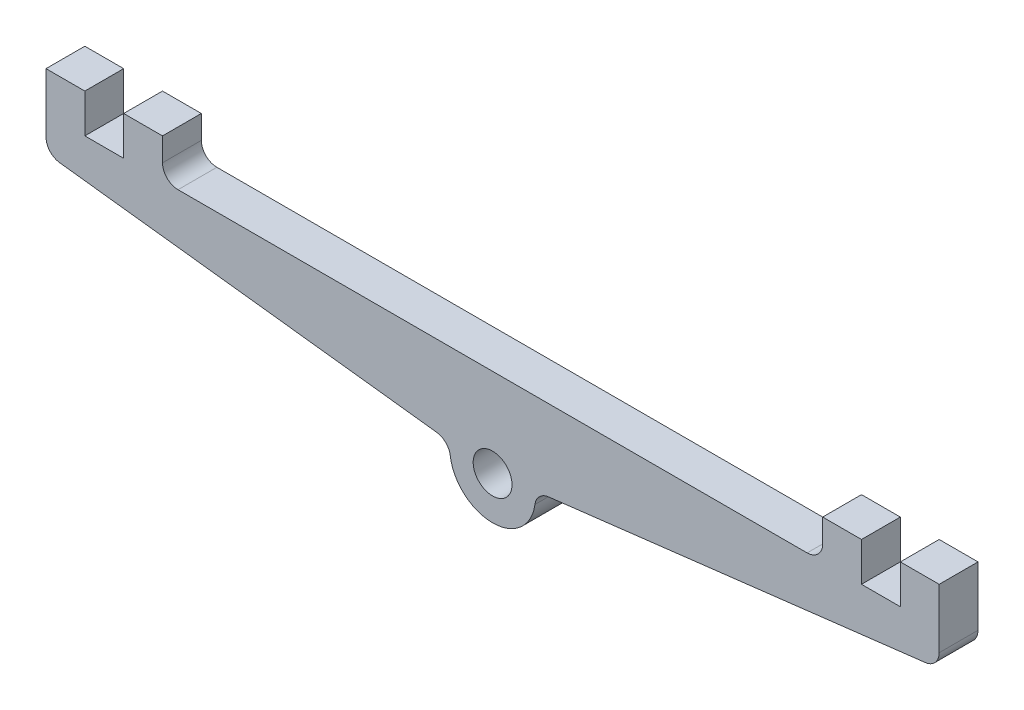
ISO-10303-21;
HEADER;
FILE_DESCRIPTION(('STEP AP214'),'2;1');
FILE_NAME('part.step','',(''),(''),'','','');
FILE_SCHEMA(('AUTOMOTIVE_DESIGN { 1 0 10303 214 1 1 1 1 }'));
ENDSEC;
DATA;
#1=APPLICATION_CONTEXT('core data for automotive mechanical design processes');
#2=APPLICATION_PROTOCOL_DEFINITION('international standard','automotive_design',2000,#1);
#3=PRODUCT_CONTEXT('',#1,'mechanical');
#4=PRODUCT('Part','Part','',(#3));
#5=PRODUCT_RELATED_PRODUCT_CATEGORY('part','',(#4));
#6=PRODUCT_DEFINITION_FORMATION('','',#4);
#7=PRODUCT_DEFINITION_CONTEXT('part definition',#1,'design');
#8=PRODUCT_DEFINITION('design','',#6,#7);
#9=PRODUCT_DEFINITION_SHAPE('','',#8);
#10=(LENGTH_UNIT() NAMED_UNIT(*) SI_UNIT(.MILLI.,.METRE.));
#11=(NAMED_UNIT(*) PLANE_ANGLE_UNIT() SI_UNIT($,.RADIAN.));
#12=(NAMED_UNIT(*) SI_UNIT($,.STERADIAN.) SOLID_ANGLE_UNIT());
#13=UNCERTAINTY_MEASURE_WITH_UNIT(LENGTH_MEASURE(1.E-05),#10,'distance_accuracy_value','');
#14=(GEOMETRIC_REPRESENTATION_CONTEXT(3) GLOBAL_UNCERTAINTY_ASSIGNED_CONTEXT((#13)) GLOBAL_UNIT_ASSIGNED_CONTEXT((#10,
#11,#12)) REPRESENTATION_CONTEXT('',''));
#15=CARTESIAN_POINT('',(0.,0.,0.));
#16=DIRECTION('',(0.,0.,1.));
#17=DIRECTION('',(1.,0.,0.));
#18=AXIS2_PLACEMENT_3D('',#15,#16,#17);
#19=CARTESIAN_POINT('',(-70.485,11.1402036282603,6.35));
#20=DIRECTION('',(0.,0.,1.));
#21=DIRECTION('',(1.,0.,0.));
#22=AXIS2_PLACEMENT_3D('',#19,#20,#21);
#23=PLANE('',#22);
#24=DIRECTION('',(0.,1.,0.));
#25=VECTOR('',#24,1.);
#26=CARTESIAN_POINT('',(-66.675,14.478,6.35));
#27=LINE('',#26,#25);
#28=CARTESIAN_POINT('',(-66.675,14.478,6.35));
#29=VERTEX_POINT('',#28);
#30=CARTESIAN_POINT('',(-66.675,20.828,6.35));
#31=VERTEX_POINT('',#30);
#32=EDGE_CURVE('E273',#29,#31,#27,.T.);
#33=ORIENTED_EDGE('',*,*,#32,.T.);
#34=DIRECTION('',(-1.,0.,0.));
#35=VECTOR('',#34,1.);
#36=CARTESIAN_POINT('',(-66.675,20.828,6.35));
#37=LINE('',#36,#35);
#38=CARTESIAN_POINT('',(-73.025,20.828,6.35));
#39=VERTEX_POINT('',#38);
#40=EDGE_CURVE('E139',#31,#39,#37,.T.);
#41=ORIENTED_EDGE('',*,*,#40,.T.);
#42=DIRECTION('',(0.,-1.,0.));
#43=VECTOR('',#42,1.);
#44=CARTESIAN_POINT('',(-73.025,11.1402036282603,6.35));
#45=LINE('',#44,#43);
#46=CARTESIAN_POINT('',(-73.025,11.1402036282603,6.35));
#47=VERTEX_POINT('',#46);
#48=EDGE_CURVE('E336',#39,#47,#45,.T.);
#49=ORIENTED_EDGE('',*,*,#48,.T.);
#50=CARTESIAN_POINT('',(-70.485,11.1402036282603,6.35));
#51=DIRECTION('',(0.,0.,1.));
#52=DIRECTION('',(1.,0.,0.));
#53=AXIS2_PLACEMENT_3D('',#50,#51,#52);
#54=CIRCLE('',#53,2.54);
#55=CARTESIAN_POINT('',(-70.7856822234781,8.6180636241201,6.35));
#56=VERTEX_POINT('',#55);
#57=EDGE_CURVE('E354',#47,#56,#54,.T.);
#58=ORIENTED_EDGE('',*,*,#57,.T.);
#59=DIRECTION('',(0.992968505567004,-0.118378828140979,0.));
#60=VECTOR('',#59,1.);
#61=CARTESIAN_POINT('',(-66.675,8.128,6.35));
#62=LINE('',#61,#60);
#63=CARTESIAN_POINT('',(-9.14152782852135,1.2690261490094,6.35));
#64=VERTEX_POINT('',#63);
#65=EDGE_CURVE('E351',#56,#64,#62,.T.);
#66=ORIENTED_EDGE('',*,*,#65,.T.);
#67=CARTESIAN_POINT('',(-9.44221005199944,-1.25311385513078,6.35));
#68=DIRECTION('',(0.,0.,-1.));
#69=DIRECTION('',(-1.,0.,0.));
#70=AXIS2_PLACEMENT_3D('',#67,#68,#69);
#71=CIRCLE('',#70,2.54);
#72=CARTESIAN_POINT('',(-6.92428737146626,-0.918950160429241,6.35));
#73=VERTEX_POINT('',#72);
#74=EDGE_CURVE('E353',#64,#73,#71,.T.);
#75=ORIENTED_EDGE('',*,*,#74,.T.);
#76=CARTESIAN_POINT('',(0.,0.,6.35));
#77=DIRECTION('',(0.,0.,1.));
#78=DIRECTION('',(1.,0.,0.));
#79=AXIS2_PLACEMENT_3D('',#76,#77,#78);
#80=CIRCLE('',#79,6.985);
#81=CARTESIAN_POINT('',(6.92428737146626,-0.918950160429242,6.35));
#82=VERTEX_POINT('',#81);
#83=EDGE_CURVE('E356',#73,#82,#80,.T.);
#84=ORIENTED_EDGE('',*,*,#83,.T.);
#85=CARTESIAN_POINT('',(9.44221005199944,-1.25311385513078,6.35));
#86=DIRECTION('',(0.,0.,-1.));
#87=DIRECTION('',(1.,0.,0.));
#88=AXIS2_PLACEMENT_3D('',#85,#86,#87);
#89=CIRCLE('',#88,2.54);
#90=CARTESIAN_POINT('',(9.14152782852135,1.2690261490094,6.35));
#91=VERTEX_POINT('',#90);
#92=EDGE_CURVE('E362',#82,#91,#89,.T.);
#93=ORIENTED_EDGE('',*,*,#92,.T.);
#94=DIRECTION('',(0.992968505567003,0.118378828140979,0.));
#95=VECTOR('',#94,1.);
#96=CARTESIAN_POINT('',(66.675,8.128,6.35));
#97=LINE('',#96,#95);
#98=CARTESIAN_POINT('',(70.7856822234781,8.6180636241201,6.35));
#99=VERTEX_POINT('',#98);
#100=EDGE_CURVE('E364',#91,#99,#97,.T.);
#101=ORIENTED_EDGE('',*,*,#100,.T.);
#102=CARTESIAN_POINT('',(70.485,11.1402036282603,6.35));
#103=DIRECTION('',(0.,0.,1.));
#104=DIRECTION('',(-1.,0.,0.));
#105=AXIS2_PLACEMENT_3D('',#102,#103,#104);
#106=CIRCLE('',#105,2.54);
#107=CARTESIAN_POINT('',(73.025,11.1402036282603,6.35));
#108=VERTEX_POINT('',#107);
#109=EDGE_CURVE('E366',#99,#108,#106,.T.);
#110=ORIENTED_EDGE('',*,*,#109,.T.);
#111=DIRECTION('',(0.,1.,0.));
#112=VECTOR('',#111,1.);
#113=CARTESIAN_POINT('',(73.025,11.1402036282603,6.35));
#114=LINE('',#113,#112);
#115=CARTESIAN_POINT('',(73.025,20.828,6.35));
#116=VERTEX_POINT('',#115);
#117=EDGE_CURVE('E368',#108,#116,#114,.T.);
#118=ORIENTED_EDGE('',*,*,#117,.T.);
#119=DIRECTION('',(-1.,0.,0.));
#120=VECTOR('',#119,1.);
#121=CARTESIAN_POINT('',(66.675,20.828,6.35));
#122=LINE('',#121,#120);
#123=CARTESIAN_POINT('',(66.675,20.828,6.35));
#124=VERTEX_POINT('',#123);
#125=EDGE_CURVE('E370',#116,#124,#122,.T.);
#126=ORIENTED_EDGE('',*,*,#125,.T.);
#127=DIRECTION('',(0.,-1.,0.));
#128=VECTOR('',#127,1.);
#129=CARTESIAN_POINT('',(66.675,14.478,6.35));
#130=LINE('',#129,#128);
#131=CARTESIAN_POINT('',(66.675,14.478,6.35));
#132=VERTEX_POINT('',#131);
#133=EDGE_CURVE('E372',#124,#132,#130,.T.);
#134=ORIENTED_EDGE('',*,*,#133,.T.);
#135=DIRECTION('',(-1.,0.,0.));
#136=VECTOR('',#135,1.);
#137=CARTESIAN_POINT('',(66.675,14.478,6.35));
#138=LINE('',#137,#136);
#139=CARTESIAN_POINT('',(60.325,14.478,6.35));
#140=VERTEX_POINT('',#139);
#141=EDGE_CURVE('E374',#132,#140,#138,.T.);
#142=ORIENTED_EDGE('',*,*,#141,.T.);
#143=DIRECTION('',(0.,1.,0.));
#144=VECTOR('',#143,1.);
#145=CARTESIAN_POINT('',(60.325,14.478,6.35));
#146=LINE('',#145,#144);
#147=CARTESIAN_POINT('',(60.325,20.828,6.35));
#148=VERTEX_POINT('',#147);
#149=EDGE_CURVE('E376',#140,#148,#146,.T.);
#150=ORIENTED_EDGE('',*,*,#149,.T.);
#151=DIRECTION('',(-1.,0.,0.));
#152=VECTOR('',#151,1.);
#153=CARTESIAN_POINT('',(60.325,20.828,6.35));
#154=LINE('',#153,#152);
#155=CARTESIAN_POINT('',(53.975,20.828,6.35));
#156=VERTEX_POINT('',#155);
#157=EDGE_CURVE('E378',#148,#156,#154,.T.);
#158=ORIENTED_EDGE('',*,*,#157,.T.);
#159=DIRECTION('',(0.,-1.,0.));
#160=VECTOR('',#159,1.);
#161=CARTESIAN_POINT('',(53.975,20.828,6.35));
#162=LINE('',#161,#160);
#163=CARTESIAN_POINT('',(53.975,17.018,6.35));
#164=VERTEX_POINT('',#163);
#165=EDGE_CURVE('E380',#156,#164,#162,.T.);
#166=ORIENTED_EDGE('',*,*,#165,.T.);
#167=CARTESIAN_POINT('',(51.435,17.018,6.35));
#168=DIRECTION('',(0.,0.,-1.));
#169=DIRECTION('',(1.,0.,0.));
#170=AXIS2_PLACEMENT_3D('',#167,#168,#169);
#171=CIRCLE('',#170,2.54);
#172=CARTESIAN_POINT('',(51.435,14.478,6.35));
#173=VERTEX_POINT('',#172);
#174=EDGE_CURVE('E382',#164,#173,#171,.T.);
#175=ORIENTED_EDGE('',*,*,#174,.T.);
#176=DIRECTION('',(-1.,0.,0.));
#177=VECTOR('',#176,1.);
#178=CARTESIAN_POINT('',(-51.435,14.478,6.35));
#179=LINE('',#178,#177);
#180=CARTESIAN_POINT('',(-51.435,14.478,6.35));
#181=VERTEX_POINT('',#180);
#182=EDGE_CURVE('E384',#173,#181,#179,.T.);
#183=ORIENTED_EDGE('',*,*,#182,.T.);
#184=CARTESIAN_POINT('',(-51.435,17.018,6.35));
#185=DIRECTION('',(0.,0.,-1.));
#186=DIRECTION('',(-1.,0.,0.));
#187=AXIS2_PLACEMENT_3D('',#184,#185,#186);
#188=CIRCLE('',#187,2.54);
#189=CARTESIAN_POINT('',(-53.975,17.018,6.35));
#190=VERTEX_POINT('',#189);
#191=EDGE_CURVE('E386',#181,#190,#188,.T.);
#192=ORIENTED_EDGE('',*,*,#191,.T.);
#193=DIRECTION('',(0.,1.,0.));
#194=VECTOR('',#193,1.);
#195=CARTESIAN_POINT('',(-53.975,20.828,6.35));
#196=LINE('',#195,#194);
#197=CARTESIAN_POINT('',(-53.975,20.828,6.35));
#198=VERTEX_POINT('',#197);
#199=EDGE_CURVE('E206',#190,#198,#196,.T.);
#200=ORIENTED_EDGE('',*,*,#199,.T.);
#201=DIRECTION('',(-1.,0.,0.));
#202=VECTOR('',#201,1.);
#203=CARTESIAN_POINT('',(-60.325,20.828,6.35));
#204=LINE('',#203,#202);
#205=CARTESIAN_POINT('',(-60.325,20.828,6.35));
#206=VERTEX_POINT('',#205);
#207=EDGE_CURVE('E200',#198,#206,#204,.T.);
#208=ORIENTED_EDGE('',*,*,#207,.T.);
#209=DIRECTION('',(0.,-1.,0.));
#210=VECTOR('',#209,1.);
#211=CARTESIAN_POINT('',(-60.325,14.478,6.35));
#212=LINE('',#211,#210);
#213=CARTESIAN_POINT('',(-60.325,14.478,6.35));
#214=VERTEX_POINT('',#213);
#215=EDGE_CURVE('E204',#206,#214,#212,.T.);
#216=ORIENTED_EDGE('',*,*,#215,.T.);
#217=DIRECTION('',(-1.,0.,0.));
#218=VECTOR('',#217,1.);
#219=CARTESIAN_POINT('',(-66.675,14.478,6.35));
#220=LINE('',#219,#218);
#221=EDGE_CURVE('E48',#214,#29,#220,.T.);
#222=ORIENTED_EDGE('',*,*,#221,.T.);
#223=EDGE_LOOP('',(#33,#41,#49,#58,#66,#75,#84,#93,#101,#110,#118,#126,#134,#142,#150,#158,#166,
#175,#183,#192,#200,#208,#216,#222));
#224=FACE_BOUND('',#223,.T.);
#225=CARTESIAN_POINT('',(0.,0.,6.35));
#226=DIRECTION('',(0.,0.,1.));
#227=DIRECTION('',(1.,0.,0.));
#228=AXIS2_PLACEMENT_3D('',#225,#226,#227);
#229=CIRCLE('',#228,3.175);
#230=CARTESIAN_POINT('',(3.175,0.,6.35));
#231=VERTEX_POINT('',#230);
#232=EDGE_CURVE('E228',#231,#231,#229,.T.);
#233=ORIENTED_EDGE('',*,*,#232,.F.);
#234=EDGE_LOOP('',(#233));
#235=FACE_BOUND('',#234,.T.);
#236=ADVANCED_FACE('F31',(#224,#235),#23,.T.);
#237=CARTESIAN_POINT('',(-70.485,11.1402036282603,0.));
#238=DIRECTION('',(0.,0.,1.));
#239=DIRECTION('',(1.,0.,0.));
#240=AXIS2_PLACEMENT_3D('',#237,#238,#239);
#241=PLANE('',#240);
#242=DIRECTION('',(0.,1.,0.));
#243=VECTOR('',#242,1.);
#244=CARTESIAN_POINT('',(-66.675,14.478,0.));
#245=LINE('',#244,#243);
#246=CARTESIAN_POINT('',(-66.675,14.478,0.));
#247=VERTEX_POINT('',#246);
#248=CARTESIAN_POINT('',(-66.675,20.828,0.));
#249=VERTEX_POINT('',#248);
#250=EDGE_CURVE('E224',#247,#249,#245,.T.);
#251=ORIENTED_EDGE('',*,*,#250,.F.);
#252=DIRECTION('',(-1.,0.,0.));
#253=VECTOR('',#252,1.);
#254=CARTESIAN_POINT('',(-66.675,14.478,0.));
#255=LINE('',#254,#253);
#256=CARTESIAN_POINT('',(-60.325,14.478,0.));
#257=VERTEX_POINT('',#256);
#258=EDGE_CURVE('E131',#257,#247,#255,.T.);
#259=ORIENTED_EDGE('',*,*,#258,.F.);
#260=DIRECTION('',(0.,-1.,0.));
#261=VECTOR('',#260,1.);
#262=CARTESIAN_POINT('',(-60.325,14.478,0.));
#263=LINE('',#262,#261);
#264=CARTESIAN_POINT('',(-60.325,20.828,0.));
#265=VERTEX_POINT('',#264);
#266=EDGE_CURVE('E125',#265,#257,#263,.T.);
#267=ORIENTED_EDGE('',*,*,#266,.F.);
#268=DIRECTION('',(-1.,0.,0.));
#269=VECTOR('',#268,1.);
#270=CARTESIAN_POINT('',(-60.325,20.828,0.));
#271=LINE('',#270,#269);
#272=CARTESIAN_POINT('',(-53.975,20.828,0.));
#273=VERTEX_POINT('',#272);
#274=EDGE_CURVE('E214',#273,#265,#271,.T.);
#275=ORIENTED_EDGE('',*,*,#274,.F.);
#276=DIRECTION('',(0.,1.,0.));
#277=VECTOR('',#276,1.);
#278=CARTESIAN_POINT('',(-53.975,20.828,0.));
#279=LINE('',#278,#277);
#280=CARTESIAN_POINT('',(-53.975,17.018,0.));
#281=VERTEX_POINT('',#280);
#282=EDGE_CURVE('E268',#281,#273,#279,.T.);
#283=ORIENTED_EDGE('',*,*,#282,.F.);
#284=CARTESIAN_POINT('',(-51.435,17.018,0.));
#285=DIRECTION('',(0.,0.,-1.));
#286=DIRECTION('',(-1.,0.,0.));
#287=AXIS2_PLACEMENT_3D('',#284,#285,#286);
#288=CIRCLE('',#287,2.54);
#289=CARTESIAN_POINT('',(-51.435,14.478,0.));
#290=VERTEX_POINT('',#289);
#291=EDGE_CURVE('E266',#290,#281,#288,.T.);
#292=ORIENTED_EDGE('',*,*,#291,.F.);
#293=DIRECTION('',(-1.,0.,0.));
#294=VECTOR('',#293,1.);
#295=CARTESIAN_POINT('',(-51.435,14.478,0.));
#296=LINE('',#295,#294);
#297=CARTESIAN_POINT('',(51.435,14.478,0.));
#298=VERTEX_POINT('',#297);
#299=EDGE_CURVE('E264',#298,#290,#296,.T.);
#300=ORIENTED_EDGE('',*,*,#299,.F.);
#301=CARTESIAN_POINT('',(51.435,17.018,0.));
#302=DIRECTION('',(0.,0.,-1.));
#303=DIRECTION('',(1.,0.,0.));
#304=AXIS2_PLACEMENT_3D('',#301,#302,#303);
#305=CIRCLE('',#304,2.54);
#306=CARTESIAN_POINT('',(53.975,17.018,0.));
#307=VERTEX_POINT('',#306);
#308=EDGE_CURVE('E262',#307,#298,#305,.T.);
#309=ORIENTED_EDGE('',*,*,#308,.F.);
#310=DIRECTION('',(0.,-1.,0.));
#311=VECTOR('',#310,1.);
#312=CARTESIAN_POINT('',(53.975,20.828,0.));
#313=LINE('',#312,#311);
#314=CARTESIAN_POINT('',(53.975,20.828,0.));
#315=VERTEX_POINT('',#314);
#316=EDGE_CURVE('E260',#315,#307,#313,.T.);
#317=ORIENTED_EDGE('',*,*,#316,.F.);
#318=DIRECTION('',(-1.,0.,0.));
#319=VECTOR('',#318,1.);
#320=CARTESIAN_POINT('',(60.325,20.828,0.));
#321=LINE('',#320,#319);
#322=CARTESIAN_POINT('',(60.325,20.828,0.));
#323=VERTEX_POINT('',#322);
#324=EDGE_CURVE('E258',#323,#315,#321,.T.);
#325=ORIENTED_EDGE('',*,*,#324,.F.);
#326=DIRECTION('',(0.,1.,0.));
#327=VECTOR('',#326,1.);
#328=CARTESIAN_POINT('',(60.325,14.478,0.));
#329=LINE('',#328,#327);
#330=CARTESIAN_POINT('',(60.325,14.478,0.));
#331=VERTEX_POINT('',#330);
#332=EDGE_CURVE('E256',#331,#323,#329,.T.);
#333=ORIENTED_EDGE('',*,*,#332,.F.);
#334=DIRECTION('',(-1.,0.,0.));
#335=VECTOR('',#334,1.);
#336=CARTESIAN_POINT('',(66.675,14.478,0.));
#337=LINE('',#336,#335);
#338=CARTESIAN_POINT('',(66.675,14.478,0.));
#339=VERTEX_POINT('',#338);
#340=EDGE_CURVE('E254',#339,#331,#337,.T.);
#341=ORIENTED_EDGE('',*,*,#340,.F.);
#342=DIRECTION('',(0.,-1.,0.));
#343=VECTOR('',#342,1.);
#344=CARTESIAN_POINT('',(66.675,14.478,0.));
#345=LINE('',#344,#343);
#346=CARTESIAN_POINT('',(66.675,20.828,0.));
#347=VERTEX_POINT('',#346);
#348=EDGE_CURVE('E252',#347,#339,#345,.T.);
#349=ORIENTED_EDGE('',*,*,#348,.F.);
#350=DIRECTION('',(-1.,0.,0.));
#351=VECTOR('',#350,1.);
#352=CARTESIAN_POINT('',(66.675,20.828,0.));
#353=LINE('',#352,#351);
#354=CARTESIAN_POINT('',(73.025,20.828,0.));
#355=VERTEX_POINT('',#354);
#356=EDGE_CURVE('E250',#355,#347,#353,.T.);
#357=ORIENTED_EDGE('',*,*,#356,.F.);
#358=DIRECTION('',(0.,1.,0.));
#359=VECTOR('',#358,1.);
#360=CARTESIAN_POINT('',(73.025,11.1402036282603,0.));
#361=LINE('',#360,#359);
#362=CARTESIAN_POINT('',(73.025,11.1402036282603,0.));
#363=VERTEX_POINT('',#362);
#364=EDGE_CURVE('E248',#363,#355,#361,.T.);
#365=ORIENTED_EDGE('',*,*,#364,.F.);
#366=CARTESIAN_POINT('',(70.485,11.1402036282603,0.));
#367=DIRECTION('',(0.,0.,1.));
#368=DIRECTION('',(-1.,0.,0.));
#369=AXIS2_PLACEMENT_3D('',#366,#367,#368);
#370=CIRCLE('',#369,2.54);
#371=CARTESIAN_POINT('',(70.7856822234781,8.6180636241201,0.));
#372=VERTEX_POINT('',#371);
#373=EDGE_CURVE('E246',#372,#363,#370,.T.);
#374=ORIENTED_EDGE('',*,*,#373,.F.);
#375=DIRECTION('',(0.992968505567004,0.118378828140979,0.));
#376=VECTOR('',#375,1.);
#377=CARTESIAN_POINT('',(66.675,8.128,0.));
#378=LINE('',#377,#376);
#379=CARTESIAN_POINT('',(9.14152782852135,1.2690261490094,0.));
#380=VERTEX_POINT('',#379);
#381=EDGE_CURVE('E244',#380,#372,#378,.T.);
#382=ORIENTED_EDGE('',*,*,#381,.F.);
#383=CARTESIAN_POINT('',(9.44221005199944,-1.25311385513078,0.));
#384=DIRECTION('',(0.,0.,-1.));
#385=DIRECTION('',(1.,0.,0.));
#386=AXIS2_PLACEMENT_3D('',#383,#384,#385);
#387=CIRCLE('',#386,2.54);
#388=CARTESIAN_POINT('',(6.92428737146626,-0.918950160429242,0.));
#389=VERTEX_POINT('',#388);
#390=EDGE_CURVE('E241',#389,#380,#387,.T.);
#391=ORIENTED_EDGE('',*,*,#390,.F.);
#392=CARTESIAN_POINT('',(0.,0.,0.));
#393=DIRECTION('',(0.,0.,1.));
#394=DIRECTION('',(1.,0.,0.));
#395=AXIS2_PLACEMENT_3D('',#392,#393,#394);
#396=CIRCLE('',#395,6.985);
#397=CARTESIAN_POINT('',(-6.92428737146626,-0.918950160429241,0.));
#398=VERTEX_POINT('',#397);
#399=EDGE_CURVE('E239',#398,#389,#396,.T.);
#400=ORIENTED_EDGE('',*,*,#399,.F.);
#401=CARTESIAN_POINT('',(-9.44221005199944,-1.25311385513078,0.));
#402=DIRECTION('',(0.,0.,-1.));
#403=DIRECTION('',(-1.,0.,0.));
#404=AXIS2_PLACEMENT_3D('',#401,#402,#403);
#405=CIRCLE('',#404,2.54);
#406=CARTESIAN_POINT('',(-9.14152782852135,1.2690261490094,0.));
#407=VERTEX_POINT('',#406);
#408=EDGE_CURVE('E237',#407,#398,#405,.T.);
#409=ORIENTED_EDGE('',*,*,#408,.F.);
#410=DIRECTION('',(0.992968505567003,-0.118378828140979,0.));
#411=VECTOR('',#410,1.);
#412=CARTESIAN_POINT('',(-66.675,8.128,0.));
#413=LINE('',#412,#411);
#414=CARTESIAN_POINT('',(-70.7856822234781,8.6180636241201,0.));
#415=VERTEX_POINT('',#414);
#416=EDGE_CURVE('E235',#415,#407,#413,.T.);
#417=ORIENTED_EDGE('',*,*,#416,.F.);
#418=CARTESIAN_POINT('',(-70.485,11.1402036282603,0.));
#419=DIRECTION('',(0.,0.,1.));
#420=DIRECTION('',(1.,0.,0.));
#421=AXIS2_PLACEMENT_3D('',#418,#419,#420);
#422=CIRCLE('',#421,2.54);
#423=CARTESIAN_POINT('',(-73.025,11.1402036282603,0.));
#424=VERTEX_POINT('',#423);
#425=EDGE_CURVE('E232',#424,#415,#422,.T.);
#426=ORIENTED_EDGE('',*,*,#425,.F.);
#427=DIRECTION('',(0.,-1.,0.));
#428=VECTOR('',#427,1.);
#429=CARTESIAN_POINT('',(-73.025,11.1402036282603,0.));
#430=LINE('',#429,#428);
#431=CARTESIAN_POINT('',(-73.025,20.828,0.));
#432=VERTEX_POINT('',#431);
#433=EDGE_CURVE('E230',#432,#424,#430,.T.);
#434=ORIENTED_EDGE('',*,*,#433,.F.);
#435=DIRECTION('',(-1.,0.,0.));
#436=VECTOR('',#435,1.);
#437=CARTESIAN_POINT('',(-66.675,20.828,0.));
#438=LINE('',#437,#436);
#439=EDGE_CURVE('E227',#249,#432,#438,.T.);
#440=ORIENTED_EDGE('',*,*,#439,.F.);
#441=EDGE_LOOP('',(#251,#259,#267,#275,#283,#292,#300,#309,#317,#325,#333,#341,#349,#357,#365,
#374,#382,#391,#400,#409,#417,#426,#434,#440));
#442=FACE_BOUND('',#441,.T.);
#443=CARTESIAN_POINT('',(0.,0.,0.));
#444=DIRECTION('',(0.,0.,1.));
#445=DIRECTION('',(1.,0.,0.));
#446=AXIS2_PLACEMENT_3D('',#443,#444,#445);
#447=CIRCLE('',#446,3.175);
#448=CARTESIAN_POINT('',(3.175,0.,0.));
#449=VERTEX_POINT('',#448);
#450=EDGE_CURVE('E694',#449,#449,#447,.T.);
#451=ORIENTED_EDGE('',*,*,#450,.T.);
#452=EDGE_LOOP('',(#451));
#453=FACE_BOUND('',#452,.T.);
#454=ADVANCED_FACE('F340',(#442,#453),#241,.F.);
#455=CARTESIAN_POINT('',(-66.675,14.478,6.35));
#456=DIRECTION('',(-1.,0.,0.));
#457=DIRECTION('',(0.,0.,1.));
#458=AXIS2_PLACEMENT_3D('',#455,#456,#457);
#459=PLANE('',#458);
#460=ORIENTED_EDGE('',*,*,#250,.T.);
#461=DIRECTION('',(0.,0.,-1.));
#462=VECTOR('',#461,1.);
#463=CARTESIAN_POINT('',(-66.675,20.828,6.35));
#464=LINE('',#463,#462);
#465=EDGE_CURVE('E11',#31,#249,#464,.T.);
#466=ORIENTED_EDGE('',*,*,#465,.F.);
#467=ORIENTED_EDGE('',*,*,#32,.F.);
#468=DIRECTION('',(0.,0.,-1.));
#469=VECTOR('',#468,1.);
#470=CARTESIAN_POINT('',(-66.675,14.478,6.35));
#471=LINE('',#470,#469);
#472=EDGE_CURVE('E220',#29,#247,#471,.T.);
#473=ORIENTED_EDGE('',*,*,#472,.T.);
#474=EDGE_LOOP('',(#460,#466,#467,#473));
#475=FACE_BOUND('',#474,.T.);
#476=ADVANCED_FACE('F33',(#475),#459,.F.);
#477=CARTESIAN_POINT('',(-66.675,20.828,6.35));
#478=DIRECTION('',(0.,-1.,0.));
#479=DIRECTION('',(0.,0.,-1.));
#480=AXIS2_PLACEMENT_3D('',#477,#478,#479);
#481=PLANE('',#480);
#482=ORIENTED_EDGE('',*,*,#439,.T.);
#483=DIRECTION('',(0.,0.,-1.));
#484=VECTOR('',#483,1.);
#485=CARTESIAN_POINT('',(-73.025,20.828,6.35));
#486=LINE('',#485,#484);
#487=EDGE_CURVE('E40',#39,#432,#486,.T.);
#488=ORIENTED_EDGE('',*,*,#487,.F.);
#489=ORIENTED_EDGE('',*,*,#40,.F.);
#490=ORIENTED_EDGE('',*,*,#465,.T.);
#491=EDGE_LOOP('',(#482,#488,#489,#490));
#492=FACE_BOUND('',#491,.T.);
#493=ADVANCED_FACE('F420',(#492),#481,.F.);
#494=CARTESIAN_POINT('',(-73.025,11.1402036282603,6.35));
#495=DIRECTION('',(1.,0.,0.));
#496=DIRECTION('',(0.,0.,-1.));
#497=AXIS2_PLACEMENT_3D('',#494,#495,#496);
#498=PLANE('',#497);
#499=ORIENTED_EDGE('',*,*,#433,.T.);
#500=DIRECTION('',(0.,0.,-1.));
#501=VECTOR('',#500,1.);
#502=CARTESIAN_POINT('',(-73.025,11.1402036282603,6.35));
#503=LINE('',#502,#501);
#504=EDGE_CURVE('E328',#47,#424,#503,.T.);
#505=ORIENTED_EDGE('',*,*,#504,.F.);
#506=ORIENTED_EDGE('',*,*,#48,.F.);
#507=ORIENTED_EDGE('',*,*,#487,.T.);
#508=EDGE_LOOP('',(#499,#505,#506,#507));
#509=FACE_BOUND('',#508,.T.);
#510=ADVANCED_FACE('F334',(#509),#498,.F.);
#511=CARTESIAN_POINT('',(-70.485,11.1402036282603,6.35));
#512=DIRECTION('',(0.,0.,-1.));
#513=DIRECTION('',(-1.,0.,0.));
#514=AXIS2_PLACEMENT_3D('',#511,#512,#513);
#515=CYLINDRICAL_SURFACE('',#514,2.54);
#516=ORIENTED_EDGE('',*,*,#425,.T.);
#517=DIRECTION('',(0.,0.,-1.));
#518=VECTOR('',#517,1.);
#519=CARTESIAN_POINT('',(-70.7856822234781,8.6180636241201,6.35));
#520=LINE('',#519,#518);
#521=EDGE_CURVE('E325',#56,#415,#520,.T.);
#522=ORIENTED_EDGE('',*,*,#521,.F.);
#523=ORIENTED_EDGE('',*,*,#57,.F.);
#524=ORIENTED_EDGE('',*,*,#504,.T.);
#525=EDGE_LOOP('',(#516,#522,#523,#524));
#526=FACE_BOUND('',#525,.T.);
#527=ADVANCED_FACE('F345',(#526),#515,.T.);
#528=CARTESIAN_POINT('',(-66.675,8.128,6.35));
#529=DIRECTION('',(0.118378828140979,0.992968505567004,0.));
#530=DIRECTION('',(-0.992968505567004,0.118378828140979,0.));
#531=AXIS2_PLACEMENT_3D('',#528,#529,#530);
#532=PLANE('',#531);
#533=ORIENTED_EDGE('',*,*,#416,.T.);
#534=DIRECTION('',(0.,0.,-1.));
#535=VECTOR('',#534,1.);
#536=CARTESIAN_POINT('',(-9.14152782852135,1.2690261490094,6.35));
#537=LINE('',#536,#535);
#538=EDGE_CURVE('E322',#64,#407,#537,.T.);
#539=ORIENTED_EDGE('',*,*,#538,.F.);
#540=ORIENTED_EDGE('',*,*,#65,.F.);
#541=ORIENTED_EDGE('',*,*,#521,.T.);
#542=EDGE_LOOP('',(#533,#539,#540,#541));
#543=FACE_BOUND('',#542,.T.);
#544=ADVANCED_FACE('F349',(#543),#532,.F.);
#545=CARTESIAN_POINT('',(-9.44221005199944,-1.25311385513078,6.35));
#546=DIRECTION('',(0.,0.,-1.));
#547=DIRECTION('',(-1.,0.,0.));
#548=AXIS2_PLACEMENT_3D('',#545,#546,#547);
#549=CYLINDRICAL_SURFACE('',#548,2.54);
#550=ORIENTED_EDGE('',*,*,#408,.T.);
#551=DIRECTION('',(0.,0.,-1.));
#552=VECTOR('',#551,1.);
#553=CARTESIAN_POINT('',(-6.92428737146626,-0.918950160429241,6.35));
#554=LINE('',#553,#552);
#555=EDGE_CURVE('E319',#73,#398,#554,.T.);
#556=ORIENTED_EDGE('',*,*,#555,.F.);
#557=ORIENTED_EDGE('',*,*,#74,.F.);
#558=ORIENTED_EDGE('',*,*,#538,.T.);
#559=EDGE_LOOP('',(#550,#556,#557,#558));
#560=FACE_BOUND('',#559,.T.);
#561=ADVANCED_FACE('F433',(#560),#549,.F.);
#562=CARTESIAN_POINT('',(0.,0.,6.35));
#563=DIRECTION('',(0.,0.,-1.));
#564=DIRECTION('',(-1.,0.,0.));
#565=AXIS2_PLACEMENT_3D('',#562,#563,#564);
#566=CYLINDRICAL_SURFACE('',#565,6.985);
#567=ORIENTED_EDGE('',*,*,#399,.T.);
#568=DIRECTION('',(0.,0.,-1.));
#569=VECTOR('',#568,1.);
#570=CARTESIAN_POINT('',(6.92428737146626,-0.918950160429242,6.35));
#571=LINE('',#570,#569);
#572=EDGE_CURVE('E316',#82,#389,#571,.T.);
#573=ORIENTED_EDGE('',*,*,#572,.F.);
#574=ORIENTED_EDGE('',*,*,#83,.F.);
#575=ORIENTED_EDGE('',*,*,#555,.T.);
#576=EDGE_LOOP('',(#567,#573,#574,#575));
#577=FACE_BOUND('',#576,.T.);
#578=ADVANCED_FACE('F436',(#577),#566,.T.);
#579=CARTESIAN_POINT('',(9.44221005199944,-1.25311385513078,6.35));
#580=DIRECTION('',(0.,0.,-1.));
#581=DIRECTION('',(-1.,0.,0.));
#582=AXIS2_PLACEMENT_3D('',#579,#580,#581);
#583=CYLINDRICAL_SURFACE('',#582,2.54);
#584=ORIENTED_EDGE('',*,*,#390,.T.);
#585=DIRECTION('',(0.,0.,-1.));
#586=VECTOR('',#585,1.);
#587=CARTESIAN_POINT('',(9.14152782852135,1.2690261490094,6.35));
#588=LINE('',#587,#586);
#589=EDGE_CURVE('E313',#91,#380,#588,.T.);
#590=ORIENTED_EDGE('',*,*,#589,.F.);
#591=ORIENTED_EDGE('',*,*,#92,.F.);
#592=ORIENTED_EDGE('',*,*,#572,.T.);
#593=EDGE_LOOP('',(#584,#590,#591,#592));
#594=FACE_BOUND('',#593,.T.);
#595=ADVANCED_FACE('F440',(#594),#583,.F.);
#596=CARTESIAN_POINT('',(66.675,8.128,6.35));
#597=DIRECTION('',(-0.118378828140979,0.992968505567004,0.));
#598=DIRECTION('',(-0.992968505567004,-0.118378828140979,0.));
#599=AXIS2_PLACEMENT_3D('',#596,#597,#598);
#600=PLANE('',#599);
#601=ORIENTED_EDGE('',*,*,#381,.T.);
#602=DIRECTION('',(0.,0.,-1.));
#603=VECTOR('',#602,1.);
#604=CARTESIAN_POINT('',(70.7856822234781,8.6180636241201,6.35));
#605=LINE('',#604,#603);
#606=EDGE_CURVE('E310',#99,#372,#605,.T.);
#607=ORIENTED_EDGE('',*,*,#606,.F.);
#608=ORIENTED_EDGE('',*,*,#100,.F.);
#609=ORIENTED_EDGE('',*,*,#589,.T.);
#610=EDGE_LOOP('',(#601,#607,#608,#609));
#611=FACE_BOUND('',#610,.T.);
#612=ADVANCED_FACE('F444',(#611),#600,.F.);
#613=CARTESIAN_POINT('',(70.485,11.1402036282603,6.35));
#614=DIRECTION('',(0.,0.,-1.));
#615=DIRECTION('',(-1.,0.,0.));
#616=AXIS2_PLACEMENT_3D('',#613,#614,#615);
#617=CYLINDRICAL_SURFACE('',#616,2.54);
#618=ORIENTED_EDGE('',*,*,#373,.T.);
#619=DIRECTION('',(0.,0.,-1.));
#620=VECTOR('',#619,1.);
#621=CARTESIAN_POINT('',(73.025,11.1402036282603,6.35));
#622=LINE('',#621,#620);
#623=EDGE_CURVE('E307',#108,#363,#622,.T.);
#624=ORIENTED_EDGE('',*,*,#623,.F.);
#625=ORIENTED_EDGE('',*,*,#109,.F.);
#626=ORIENTED_EDGE('',*,*,#606,.T.);
#627=EDGE_LOOP('',(#618,#624,#625,#626));
#628=FACE_BOUND('',#627,.T.);
#629=ADVANCED_FACE('F448',(#628),#617,.T.);
#630=CARTESIAN_POINT('',(73.025,11.1402036282603,6.35));
#631=DIRECTION('',(-1.,0.,0.));
#632=DIRECTION('',(0.,0.,1.));
#633=AXIS2_PLACEMENT_3D('',#630,#631,#632);
#634=PLANE('',#633);
#635=ORIENTED_EDGE('',*,*,#364,.T.);
#636=DIRECTION('',(0.,0.,-1.));
#637=VECTOR('',#636,1.);
#638=CARTESIAN_POINT('',(73.025,20.828,6.35));
#639=LINE('',#638,#637);
#640=EDGE_CURVE('E304',#116,#355,#639,.T.);
#641=ORIENTED_EDGE('',*,*,#640,.F.);
#642=ORIENTED_EDGE('',*,*,#117,.F.);
#643=ORIENTED_EDGE('',*,*,#623,.T.);
#644=EDGE_LOOP('',(#635,#641,#642,#643));
#645=FACE_BOUND('',#644,.T.);
#646=ADVANCED_FACE('F452',(#645),#634,.F.);
#647=CARTESIAN_POINT('',(66.675,20.828,6.35));
#648=DIRECTION('',(0.,-1.,0.));
#649=DIRECTION('',(0.,0.,-1.));
#650=AXIS2_PLACEMENT_3D('',#647,#648,#649);
#651=PLANE('',#650);
#652=ORIENTED_EDGE('',*,*,#356,.T.);
#653=DIRECTION('',(0.,0.,-1.));
#654=VECTOR('',#653,1.);
#655=CARTESIAN_POINT('',(66.675,20.828,6.35));
#656=LINE('',#655,#654);
#657=EDGE_CURVE('E301',#124,#347,#656,.T.);
#658=ORIENTED_EDGE('',*,*,#657,.F.);
#659=ORIENTED_EDGE('',*,*,#125,.F.);
#660=ORIENTED_EDGE('',*,*,#640,.T.);
#661=EDGE_LOOP('',(#652,#658,#659,#660));
#662=FACE_BOUND('',#661,.T.);
#663=ADVANCED_FACE('F456',(#662),#651,.F.);
#664=CARTESIAN_POINT('',(66.675,14.478,6.35));
#665=DIRECTION('',(1.,0.,0.));
#666=DIRECTION('',(0.,0.,-1.));
#667=AXIS2_PLACEMENT_3D('',#664,#665,#666);
#668=PLANE('',#667);
#669=ORIENTED_EDGE('',*,*,#348,.T.);
#670=DIRECTION('',(0.,0.,-1.));
#671=VECTOR('',#670,1.);
#672=CARTESIAN_POINT('',(66.675,14.478,6.35));
#673=LINE('',#672,#671);
#674=EDGE_CURVE('E298',#132,#339,#673,.T.);
#675=ORIENTED_EDGE('',*,*,#674,.F.);
#676=ORIENTED_EDGE('',*,*,#133,.F.);
#677=ORIENTED_EDGE('',*,*,#657,.T.);
#678=EDGE_LOOP('',(#669,#675,#676,#677));
#679=FACE_BOUND('',#678,.T.);
#680=ADVANCED_FACE('F460',(#679),#668,.F.);
#681=CARTESIAN_POINT('',(66.675,14.478,6.35));
#682=DIRECTION('',(0.,-1.,0.));
#683=DIRECTION('',(0.,0.,-1.));
#684=AXIS2_PLACEMENT_3D('',#681,#682,#683);
#685=PLANE('',#684);
#686=ORIENTED_EDGE('',*,*,#340,.T.);
#687=DIRECTION('',(0.,0.,-1.));
#688=VECTOR('',#687,1.);
#689=CARTESIAN_POINT('',(60.325,14.478,6.35));
#690=LINE('',#689,#688);
#691=EDGE_CURVE('E295',#140,#331,#690,.T.);
#692=ORIENTED_EDGE('',*,*,#691,.F.);
#693=ORIENTED_EDGE('',*,*,#141,.F.);
#694=ORIENTED_EDGE('',*,*,#674,.T.);
#695=EDGE_LOOP('',(#686,#692,#693,#694));
#696=FACE_BOUND('',#695,.T.);
#697=ADVANCED_FACE('F464',(#696),#685,.F.);
#698=CARTESIAN_POINT('',(60.325,14.478,6.35));
#699=DIRECTION('',(-1.,0.,0.));
#700=DIRECTION('',(0.,0.,1.));
#701=AXIS2_PLACEMENT_3D('',#698,#699,#700);
#702=PLANE('',#701);
#703=ORIENTED_EDGE('',*,*,#332,.T.);
#704=DIRECTION('',(0.,0.,-1.));
#705=VECTOR('',#704,1.);
#706=CARTESIAN_POINT('',(60.325,20.828,6.35));
#707=LINE('',#706,#705);
#708=EDGE_CURVE('E292',#148,#323,#707,.T.);
#709=ORIENTED_EDGE('',*,*,#708,.F.);
#710=ORIENTED_EDGE('',*,*,#149,.F.);
#711=ORIENTED_EDGE('',*,*,#691,.T.);
#712=EDGE_LOOP('',(#703,#709,#710,#711));
#713=FACE_BOUND('',#712,.T.);
#714=ADVANCED_FACE('F468',(#713),#702,.F.);
#715=CARTESIAN_POINT('',(60.325,20.828,6.35));
#716=DIRECTION('',(0.,-1.,0.));
#717=DIRECTION('',(0.,0.,-1.));
#718=AXIS2_PLACEMENT_3D('',#715,#716,#717);
#719=PLANE('',#718);
#720=ORIENTED_EDGE('',*,*,#324,.T.);
#721=DIRECTION('',(0.,0.,-1.));
#722=VECTOR('',#721,1.);
#723=CARTESIAN_POINT('',(53.975,20.828,6.35));
#724=LINE('',#723,#722);
#725=EDGE_CURVE('E289',#156,#315,#724,.T.);
#726=ORIENTED_EDGE('',*,*,#725,.F.);
#727=ORIENTED_EDGE('',*,*,#157,.F.);
#728=ORIENTED_EDGE('',*,*,#708,.T.);
#729=EDGE_LOOP('',(#720,#726,#727,#728));
#730=FACE_BOUND('',#729,.T.);
#731=ADVANCED_FACE('F472',(#730),#719,.F.);
#732=CARTESIAN_POINT('',(53.975,20.828,6.35));
#733=DIRECTION('',(1.,0.,0.));
#734=DIRECTION('',(0.,1.,0.));
#735=AXIS2_PLACEMENT_3D('',#732,#733,#734);
#736=PLANE('',#735);
#737=ORIENTED_EDGE('',*,*,#316,.T.);
#738=DIRECTION('',(0.,0.,-1.));
#739=VECTOR('',#738,1.);
#740=CARTESIAN_POINT('',(53.975,17.018,6.35));
#741=LINE('',#740,#739);
#742=EDGE_CURVE('E286',#164,#307,#741,.T.);
#743=ORIENTED_EDGE('',*,*,#742,.F.);
#744=ORIENTED_EDGE('',*,*,#165,.F.);
#745=ORIENTED_EDGE('',*,*,#725,.T.);
#746=EDGE_LOOP('',(#737,#743,#744,#745));
#747=FACE_BOUND('',#746,.T.);
#748=ADVANCED_FACE('F476',(#747),#736,.F.);
#749=CARTESIAN_POINT('',(51.435,17.018,6.35));
#750=DIRECTION('',(0.,0.,-1.));
#751=DIRECTION('',(-1.,0.,0.));
#752=AXIS2_PLACEMENT_3D('',#749,#750,#751);
#753=CYLINDRICAL_SURFACE('',#752,2.54);
#754=ORIENTED_EDGE('',*,*,#308,.T.);
#755=DIRECTION('',(0.,0.,-1.));
#756=VECTOR('',#755,1.);
#757=CARTESIAN_POINT('',(51.435,14.478,6.35));
#758=LINE('',#757,#756);
#759=EDGE_CURVE('E283',#173,#298,#758,.T.);
#760=ORIENTED_EDGE('',*,*,#759,.F.);
#761=ORIENTED_EDGE('',*,*,#174,.F.);
#762=ORIENTED_EDGE('',*,*,#742,.T.);
#763=EDGE_LOOP('',(#754,#760,#761,#762));
#764=FACE_BOUND('',#763,.T.);
#765=ADVANCED_FACE('F480',(#764),#753,.F.);
#766=CARTESIAN_POINT('',(-51.435,14.478,6.35));
#767=DIRECTION('',(0.,-1.,0.));
#768=DIRECTION('',(0.,0.,-1.));
#769=AXIS2_PLACEMENT_3D('',#766,#767,#768);
#770=PLANE('',#769);
#771=ORIENTED_EDGE('',*,*,#299,.T.);
#772=DIRECTION('',(0.,0.,-1.));
#773=VECTOR('',#772,1.);
#774=CARTESIAN_POINT('',(-51.435,14.478,6.35));
#775=LINE('',#774,#773);
#776=EDGE_CURVE('E280',#181,#290,#775,.T.);
#777=ORIENTED_EDGE('',*,*,#776,.F.);
#778=ORIENTED_EDGE('',*,*,#182,.F.);
#779=ORIENTED_EDGE('',*,*,#759,.T.);
#780=EDGE_LOOP('',(#771,#777,#778,#779));
#781=FACE_BOUND('',#780,.T.);
#782=ADVANCED_FACE('F484',(#781),#770,.F.);
#783=CARTESIAN_POINT('',(-51.435,17.018,6.35));
#784=DIRECTION('',(0.,0.,-1.));
#785=DIRECTION('',(-1.,0.,0.));
#786=AXIS2_PLACEMENT_3D('',#783,#784,#785);
#787=CYLINDRICAL_SURFACE('',#786,2.54);
#788=ORIENTED_EDGE('',*,*,#291,.T.);
#789=DIRECTION('',(0.,0.,-1.));
#790=VECTOR('',#789,1.);
#791=CARTESIAN_POINT('',(-53.975,17.018,6.35));
#792=LINE('',#791,#790);
#793=EDGE_CURVE('E277',#190,#281,#792,.T.);
#794=ORIENTED_EDGE('',*,*,#793,.F.);
#795=ORIENTED_EDGE('',*,*,#191,.F.);
#796=ORIENTED_EDGE('',*,*,#776,.T.);
#797=EDGE_LOOP('',(#788,#794,#795,#796));
#798=FACE_BOUND('',#797,.T.);
#799=ADVANCED_FACE('F392',(#798),#787,.F.);
#800=CARTESIAN_POINT('',(-53.975,20.828,6.35));
#801=DIRECTION('',(-1.,0.,0.));
#802=DIRECTION('',(0.,-1.,0.));
#803=AXIS2_PLACEMENT_3D('',#800,#801,#802);
#804=PLANE('',#803);
#805=ORIENTED_EDGE('',*,*,#282,.T.);
#806=DIRECTION('',(0.,0.,-1.));
#807=VECTOR('',#806,1.);
#808=CARTESIAN_POINT('',(-53.975,20.828,6.35));
#809=LINE('',#808,#807);
#810=EDGE_CURVE('E215',#198,#273,#809,.T.);
#811=ORIENTED_EDGE('',*,*,#810,.F.);
#812=ORIENTED_EDGE('',*,*,#199,.F.);
#813=ORIENTED_EDGE('',*,*,#793,.T.);
#814=EDGE_LOOP('',(#805,#811,#812,#813));
#815=FACE_BOUND('',#814,.T.);
#816=ADVANCED_FACE('F396',(#815),#804,.F.);
#817=CARTESIAN_POINT('',(-60.325,20.828,6.35));
#818=DIRECTION('',(0.,-1.,0.));
#819=DIRECTION('',(0.,0.,-1.));
#820=AXIS2_PLACEMENT_3D('',#817,#818,#819);
#821=PLANE('',#820);
#822=ORIENTED_EDGE('',*,*,#274,.T.);
#823=DIRECTION('',(0.,0.,-1.));
#824=VECTOR('',#823,1.);
#825=CARTESIAN_POINT('',(-60.325,20.828,6.35));
#826=LINE('',#825,#824);
#827=EDGE_CURVE('E211',#206,#265,#826,.T.);
#828=ORIENTED_EDGE('',*,*,#827,.F.);
#829=ORIENTED_EDGE('',*,*,#207,.F.);
#830=ORIENTED_EDGE('',*,*,#810,.T.);
#831=EDGE_LOOP('',(#822,#828,#829,#830));
#832=FACE_BOUND('',#831,.T.);
#833=ADVANCED_FACE('F212',(#832),#821,.F.);
#834=CARTESIAN_POINT('',(-60.325,14.478,6.35));
#835=DIRECTION('',(1.,0.,0.));
#836=DIRECTION('',(0.,0.,-1.));
#837=AXIS2_PLACEMENT_3D('',#834,#835,#836);
#838=PLANE('',#837);
#839=ORIENTED_EDGE('',*,*,#266,.T.);
#840=DIRECTION('',(0.,0.,-1.));
#841=VECTOR('',#840,1.);
#842=CARTESIAN_POINT('',(-60.325,14.478,6.35));
#843=LINE('',#842,#841);
#844=EDGE_CURVE('E216',#214,#257,#843,.T.);
#845=ORIENTED_EDGE('',*,*,#844,.F.);
#846=ORIENTED_EDGE('',*,*,#215,.F.);
#847=ORIENTED_EDGE('',*,*,#827,.T.);
#848=EDGE_LOOP('',(#839,#845,#846,#847));
#849=FACE_BOUND('',#848,.T.);
#850=ADVANCED_FACE('F218',(#849),#838,.F.);
#851=CARTESIAN_POINT('',(-66.675,14.478,6.35));
#852=DIRECTION('',(0.,-1.,0.));
#853=DIRECTION('',(0.,0.,-1.));
#854=AXIS2_PLACEMENT_3D('',#851,#852,#853);
#855=PLANE('',#854);
#856=ORIENTED_EDGE('',*,*,#258,.T.);
#857=ORIENTED_EDGE('',*,*,#472,.F.);
#858=ORIENTED_EDGE('',*,*,#221,.F.);
#859=ORIENTED_EDGE('',*,*,#844,.T.);
#860=EDGE_LOOP('',(#856,#857,#858,#859));
#861=FACE_BOUND('',#860,.T.);
#862=ADVANCED_FACE('F400',(#861),#855,.F.);
#863=CARTESIAN_POINT('',(0.,0.,6.35));
#864=DIRECTION('',(0.,0.,-1.));
#865=DIRECTION('',(-1.,0.,0.));
#866=AXIS2_PLACEMENT_3D('',#863,#864,#865);
#867=CYLINDRICAL_SURFACE('',#866,3.175);
#868=ORIENTED_EDGE('',*,*,#232,.T.);
#869=EDGE_LOOP('',(#868));
#870=FACE_BOUND('',#869,.T.);
#871=ORIENTED_EDGE('',*,*,#450,.F.);
#872=EDGE_LOOP('',(#871));
#873=FACE_BOUND('',#872,.T.);
#874=ADVANCED_FACE('F402',(#870,#873),#867,.F.);
#875=CLOSED_SHELL('',(#236,#454,#476,#493,#510,#527,#544,#561,#578,#595,#612,#629,#646,#663,
#680,#697,#714,#731,#748,#765,#782,#799,#816,#833,#850,#862,#874));
#876=MANIFOLD_SOLID_BREP('B2',#875);
#877=ADVANCED_BREP_SHAPE_REPRESENTATION('',(#18,#876),#14);
#878=SHAPE_DEFINITION_REPRESENTATION(#9,#877);
ENDSEC;
END-ISO-10303-21;
